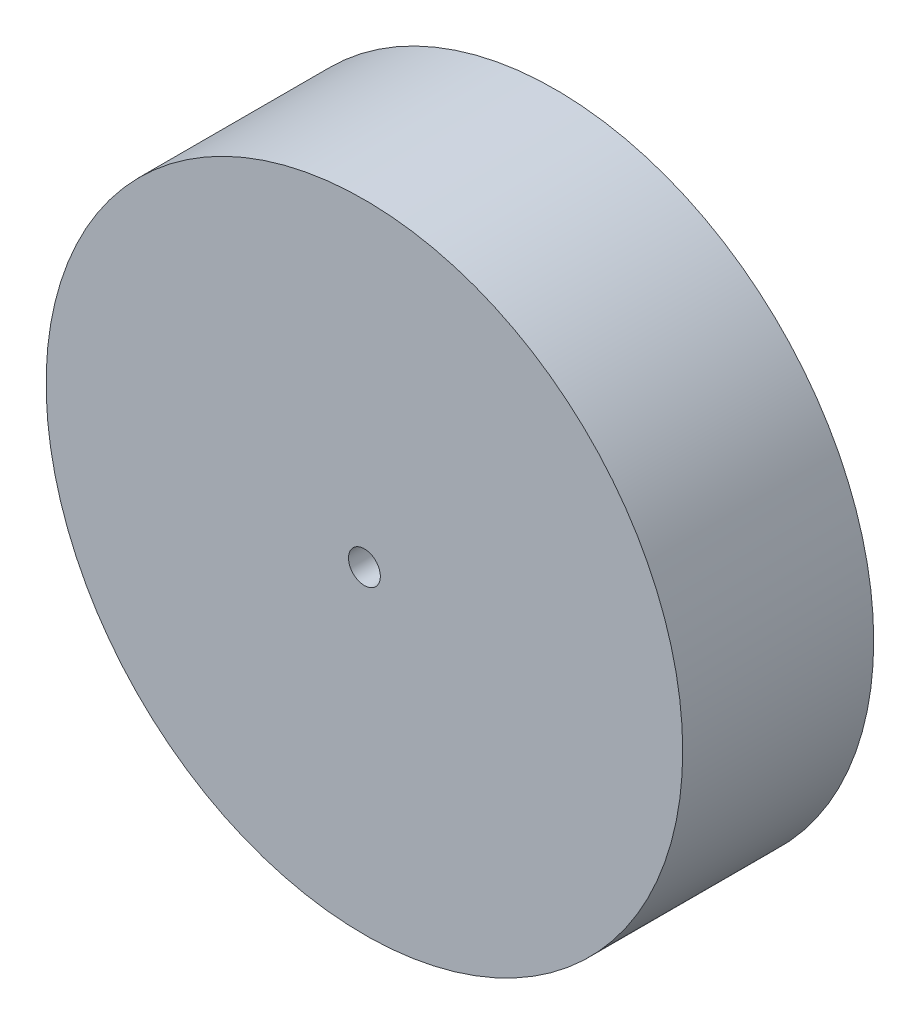
ISO-10303-21;
HEADER;
FILE_DESCRIPTION(('STEP AP214'),'2;1');
FILE_NAME('part.step','',(''),(''),'','','');
FILE_SCHEMA(('AUTOMOTIVE_DESIGN { 1 0 10303 214 1 1 1 1 }'));
ENDSEC;
DATA;
#1=APPLICATION_CONTEXT('core data for automotive mechanical design processes');
#2=APPLICATION_PROTOCOL_DEFINITION('international standard','automotive_design',2000,#1);
#3=PRODUCT_CONTEXT('',#1,'mechanical');
#4=PRODUCT('Part','Part','',(#3));
#5=PRODUCT_RELATED_PRODUCT_CATEGORY('part','',(#4));
#6=PRODUCT_DEFINITION_FORMATION('','',#4);
#7=PRODUCT_DEFINITION_CONTEXT('part definition',#1,'design');
#8=PRODUCT_DEFINITION('design','',#6,#7);
#9=PRODUCT_DEFINITION_SHAPE('','',#8);
#10=(LENGTH_UNIT() NAMED_UNIT(*) SI_UNIT(.MILLI.,.METRE.));
#11=(NAMED_UNIT(*) PLANE_ANGLE_UNIT() SI_UNIT($,.RADIAN.));
#12=(NAMED_UNIT(*) SI_UNIT($,.STERADIAN.) SOLID_ANGLE_UNIT());
#13=UNCERTAINTY_MEASURE_WITH_UNIT(LENGTH_MEASURE(1.E-05),#10,'distance_accuracy_value','');
#14=(GEOMETRIC_REPRESENTATION_CONTEXT(3) GLOBAL_UNCERTAINTY_ASSIGNED_CONTEXT((#13)) GLOBAL_UNIT_ASSIGNED_CONTEXT((#10,
#11,#12)) REPRESENTATION_CONTEXT('',''));
#15=CARTESIAN_POINT('',(0.,0.,0.));
#16=DIRECTION('',(0.,0.,1.));
#17=DIRECTION('',(1.,0.,0.));
#18=AXIS2_PLACEMENT_3D('',#15,#16,#17);
#19=CARTESIAN_POINT('',(0.,0.,0.));
#20=DIRECTION('',(0.,0.,1.));
#21=DIRECTION('',(1.,0.,0.));
#22=AXIS2_PLACEMENT_3D('',#19,#20,#21);
#23=PLANE('',#22);
#24=CARTESIAN_POINT('',(0.,0.,0.));
#25=DIRECTION('',(0.,0.,1.));
#26=DIRECTION('',(1.,0.,0.));
#27=AXIS2_PLACEMENT_3D('',#24,#25,#26);
#28=CIRCLE('',#27,12.5);
#29=CARTESIAN_POINT('',(12.5,0.,0.));
#30=VERTEX_POINT('',#29);
#31=EDGE_CURVE('E64',#30,#30,#28,.F.);
#32=ORIENTED_EDGE('',*,*,#31,.T.);
#33=EDGE_LOOP('',(#32));
#34=FACE_BOUND('',#33,.T.);
#35=CARTESIAN_POINT('',(0.,0.,0.));
#36=DIRECTION('',(0.,0.,-1.));
#37=DIRECTION('',(-1.,0.,0.));
#38=AXIS2_PLACEMENT_3D('',#35,#36,#37);
#39=CIRCLE('',#38,2.5);
#40=CARTESIAN_POINT('',(-2.5,0.,0.));
#41=VERTEX_POINT('',#40);
#42=EDGE_CURVE('E56',#41,#41,#39,.T.);
#43=ORIENTED_EDGE('',*,*,#42,.F.);
#44=EDGE_LOOP('',(#43));
#45=FACE_BOUND('',#44,.T.);
#46=ADVANCED_FACE('F41',(#34,#45),#23,.F.);
#47=CARTESIAN_POINT('',(0.,0.,30.));
#48=DIRECTION('',(0.,0.,-1.));
#49=DIRECTION('',(-1.,0.,0.));
#50=AXIS2_PLACEMENT_3D('',#47,#48,#49);
#51=CYLINDRICAL_SURFACE('',#50,50.);
#52=CARTESIAN_POINT('',(0.,0.,30.));
#53=DIRECTION('',(0.,0.,1.));
#54=DIRECTION('',(1.,0.,0.));
#55=AXIS2_PLACEMENT_3D('',#52,#53,#54);
#56=CIRCLE('',#55,50.);
#57=CARTESIAN_POINT('',(50.,0.,30.));
#58=VERTEX_POINT('',#57);
#59=EDGE_CURVE('E10',#58,#58,#56,.T.);
#60=ORIENTED_EDGE('',*,*,#59,.F.);
#61=EDGE_LOOP('',(#60));
#62=FACE_BOUND('',#61,.T.);
#63=CARTESIAN_POINT('',(0.,0.,0.));
#64=DIRECTION('',(0.,0.,1.));
#65=DIRECTION('',(1.,0.,0.));
#66=AXIS2_PLACEMENT_3D('',#63,#64,#65);
#67=CIRCLE('',#66,50.);
#68=CARTESIAN_POINT('',(50.,0.,0.));
#69=VERTEX_POINT('',#68);
#70=EDGE_CURVE('E45',#69,#69,#67,.T.);
#71=ORIENTED_EDGE('',*,*,#70,.T.);
#72=EDGE_LOOP('',(#71));
#73=FACE_BOUND('',#72,.T.);
#74=ADVANCED_FACE('F43',(#62,#73),#51,.T.);
#75=CARTESIAN_POINT('',(0.,0.,30.));
#76=DIRECTION('',(0.,0.,1.));
#77=DIRECTION('',(1.,0.,0.));
#78=AXIS2_PLACEMENT_3D('',#75,#76,#77);
#79=PLANE('',#78);
#80=CARTESIAN_POINT('',(0.,0.,30.));
#81=DIRECTION('',(0.,0.,-1.));
#82=DIRECTION('',(-1.,0.,0.));
#83=AXIS2_PLACEMENT_3D('',#80,#81,#82);
#84=CIRCLE('',#83,2.5);
#85=CARTESIAN_POINT('',(-2.5,0.,30.));
#86=VERTEX_POINT('',#85);
#87=EDGE_CURVE('E54',#86,#86,#84,.T.);
#88=ORIENTED_EDGE('',*,*,#87,.T.);
#89=EDGE_LOOP('',(#88));
#90=FACE_BOUND('',#89,.T.);
#91=ORIENTED_EDGE('',*,*,#59,.T.);
#92=EDGE_LOOP('',(#91));
#93=FACE_BOUND('',#92,.T.);
#94=ADVANCED_FACE('F103',(#90,#93),#79,.T.);
#95=CARTESIAN_POINT('',(0.,0.,0.));
#96=DIRECTION('',(0.,0.,1.));
#97=DIRECTION('',(1.,0.,0.));
#98=AXIS2_PLACEMENT_3D('',#95,#96,#97);
#99=CIRCLE('',#98,40.);
#100=CARTESIAN_POINT('',(40.,0.,0.));
#101=VERTEX_POINT('',#100);
#102=EDGE_CURVE('E69',#101,#101,#99,.T.);
#103=ORIENTED_EDGE('',*,*,#102,.T.);
#104=EDGE_LOOP('',(#103));
#105=FACE_BOUND('',#104,.T.);
#106=ORIENTED_EDGE('',*,*,#70,.F.);
#107=EDGE_LOOP('',(#106));
#108=FACE_BOUND('',#107,.T.);
#109=ADVANCED_FACE('F99',(#105,#108),#23,.F.);
#110=CARTESIAN_POINT('',(0.,0.,30.));
#111=DIRECTION('',(0.,0.,-1.));
#112=DIRECTION('',(-1.,0.,0.));
#113=AXIS2_PLACEMENT_3D('',#110,#111,#112);
#114=CYLINDRICAL_SURFACE('',#113,2.5);
#115=ORIENTED_EDGE('',*,*,#87,.F.);
#116=EDGE_LOOP('',(#115));
#117=FACE_BOUND('',#116,.T.);
#118=ORIENTED_EDGE('',*,*,#42,.T.);
#119=EDGE_LOOP('',(#118));
#120=FACE_BOUND('',#119,.T.);
#121=ADVANCED_FACE('F94',(#117,#120),#114,.F.);
#122=CARTESIAN_POINT('',(0.,0.,30.));
#123=DIRECTION('',(0.,0.,-1.));
#124=DIRECTION('',(-1.,0.,0.));
#125=AXIS2_PLACEMENT_3D('',#122,#123,#124);
#126=CYLINDRICAL_SURFACE('',#125,40.);
#127=CARTESIAN_POINT('',(0.,0.,20.));
#128=DIRECTION('',(0.,0.,1.));
#129=DIRECTION('',(1.,0.,0.));
#130=AXIS2_PLACEMENT_3D('',#127,#128,#129);
#131=CIRCLE('',#130,40.);
#132=CARTESIAN_POINT('',(40.,0.,20.));
#133=VERTEX_POINT('',#132);
#134=EDGE_CURVE('E60',#133,#133,#131,.T.);
#135=ORIENTED_EDGE('',*,*,#134,.T.);
#136=EDGE_LOOP('',(#135));
#137=FACE_BOUND('',#136,.T.);
#138=ORIENTED_EDGE('',*,*,#102,.F.);
#139=EDGE_LOOP('',(#138));
#140=FACE_BOUND('',#139,.T.);
#141=ADVANCED_FACE('F80',(#137,#140),#126,.F.);
#142=CARTESIAN_POINT('',(0.,0.,20.));
#143=DIRECTION('',(0.,0.,1.));
#144=DIRECTION('',(1.,0.,0.));
#145=AXIS2_PLACEMENT_3D('',#142,#143,#144);
#146=PLANE('',#145);
#147=CARTESIAN_POINT('',(0.,0.,20.));
#148=DIRECTION('',(0.,0.,1.));
#149=DIRECTION('',(1.,0.,0.));
#150=AXIS2_PLACEMENT_3D('',#147,#148,#149);
#151=CIRCLE('',#150,12.5);
#152=CARTESIAN_POINT('',(12.5,0.,20.));
#153=VERTEX_POINT('',#152);
#154=EDGE_CURVE('E68',#153,#153,#151,.F.);
#155=ORIENTED_EDGE('',*,*,#154,.F.);
#156=EDGE_LOOP('',(#155));
#157=FACE_BOUND('',#156,.T.);
#158=ORIENTED_EDGE('',*,*,#134,.F.);
#159=EDGE_LOOP('',(#158));
#160=FACE_BOUND('',#159,.T.);
#161=ADVANCED_FACE('F83',(#157,#160),#146,.F.);
#162=CARTESIAN_POINT('',(0.,0.,30.));
#163=DIRECTION('',(0.,0.,-1.));
#164=DIRECTION('',(-1.,0.,0.));
#165=AXIS2_PLACEMENT_3D('',#162,#163,#164);
#166=CYLINDRICAL_SURFACE('',#165,12.5);
#167=ORIENTED_EDGE('',*,*,#154,.T.);
#168=EDGE_LOOP('',(#167));
#169=FACE_BOUND('',#168,.T.);
#170=ORIENTED_EDGE('',*,*,#31,.F.);
#171=EDGE_LOOP('',(#170));
#172=FACE_BOUND('',#171,.T.);
#173=ADVANCED_FACE('F85',(#169,#172),#166,.T.);
#174=CLOSED_SHELL('',(#46,#74,#94,#109,#121,#141,#161,#173));
#175=MANIFOLD_SOLID_BREP('B2',#174);
#176=ADVANCED_BREP_SHAPE_REPRESENTATION('',(#18,#175),#14);
#177=SHAPE_DEFINITION_REPRESENTATION(#9,#176);
ENDSEC;
END-ISO-10303-21;
